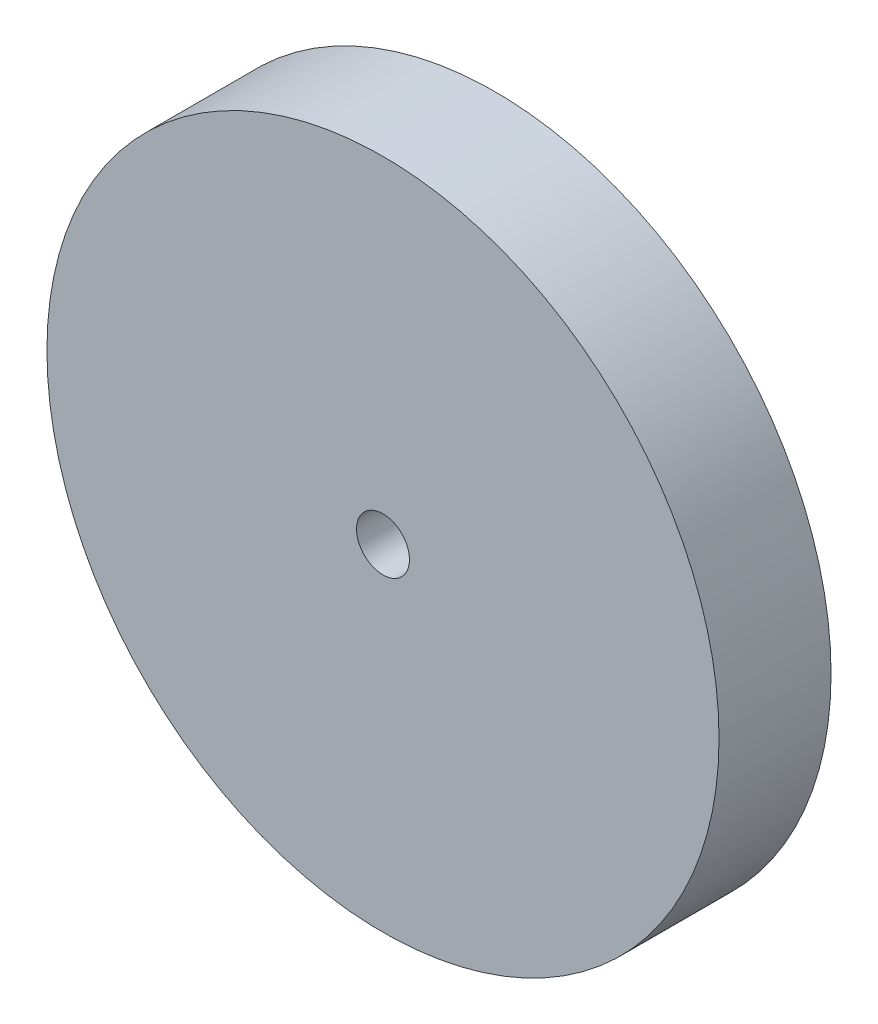
ISO-10303-21;
HEADER;
FILE_DESCRIPTION(('STEP AP214'),'2;1');
FILE_NAME('part.step','',(''),(''),'','','');
FILE_SCHEMA(('AUTOMOTIVE_DESIGN { 1 0 10303 214 1 1 1 1 }'));
ENDSEC;
DATA;
#1=APPLICATION_CONTEXT('core data for automotive mechanical design processes');
#2=APPLICATION_PROTOCOL_DEFINITION('international standard','automotive_design',2000,#1);
#3=PRODUCT_CONTEXT('',#1,'mechanical');
#4=PRODUCT('Part','Part','',(#3));
#5=PRODUCT_RELATED_PRODUCT_CATEGORY('part','',(#4));
#6=PRODUCT_DEFINITION_FORMATION('','',#4);
#7=PRODUCT_DEFINITION_CONTEXT('part definition',#1,'design');
#8=PRODUCT_DEFINITION('design','',#6,#7);
#9=PRODUCT_DEFINITION_SHAPE('','',#8);
#10=(LENGTH_UNIT() NAMED_UNIT(*) SI_UNIT(.MILLI.,.METRE.));
#11=(NAMED_UNIT(*) PLANE_ANGLE_UNIT() SI_UNIT($,.RADIAN.));
#12=(NAMED_UNIT(*) SI_UNIT($,.STERADIAN.) SOLID_ANGLE_UNIT());
#13=UNCERTAINTY_MEASURE_WITH_UNIT(LENGTH_MEASURE(1.E-05),#10,'distance_accuracy_value','');
#14=(GEOMETRIC_REPRESENTATION_CONTEXT(3) GLOBAL_UNCERTAINTY_ASSIGNED_CONTEXT((#13)) GLOBAL_UNIT_ASSIGNED_CONTEXT((#10,
#11,#12)) REPRESENTATION_CONTEXT('',''));
#15=CARTESIAN_POINT('',(0.,0.,0.));
#16=DIRECTION('',(0.,0.,1.));
#17=DIRECTION('',(1.,0.,0.));
#18=AXIS2_PLACEMENT_3D('',#15,#16,#17);
#19=CARTESIAN_POINT('',(0.,0.,12.7));
#20=DIRECTION('',(0.,0.,-1.));
#21=DIRECTION('',(-1.,0.,0.));
#22=AXIS2_PLACEMENT_3D('',#19,#20,#21);
#23=CYLINDRICAL_SURFACE('',#22,3.);
#24=CARTESIAN_POINT('',(0.,0.,12.7));
#25=DIRECTION('',(0.,0.,1.));
#26=DIRECTION('',(1.,0.,0.));
#27=AXIS2_PLACEMENT_3D('',#24,#25,#26);
#28=CIRCLE('',#27,3.);
#29=CARTESIAN_POINT('',(3.,0.,12.7));
#30=VERTEX_POINT('',#29);
#31=EDGE_CURVE('E46',#30,#30,#28,.T.);
#32=ORIENTED_EDGE('',*,*,#31,.T.);
#33=EDGE_LOOP('',(#32));
#34=FACE_BOUND('',#33,.T.);
#35=CARTESIAN_POINT('',(0.,0.,5.08));
#36=DIRECTION('',(0.,0.,-1.));
#37=DIRECTION('',(-1.,0.,0.));
#38=AXIS2_PLACEMENT_3D('',#35,#36,#37);
#39=CIRCLE('',#38,3.);
#40=CARTESIAN_POINT('',(-3.,0.,5.08));
#41=VERTEX_POINT('',#40);
#42=EDGE_CURVE('E37',#41,#41,#39,.T.);
#43=ORIENTED_EDGE('',*,*,#42,.T.);
#44=EDGE_LOOP('',(#43));
#45=FACE_BOUND('',#44,.T.);
#46=ADVANCED_FACE('F33',(#34,#45),#23,.F.);
#47=CARTESIAN_POINT('',(0.,0.,12.7));
#48=DIRECTION('',(0.,0.,1.));
#49=DIRECTION('',(1.,0.,0.));
#50=AXIS2_PLACEMENT_3D('',#47,#48,#49);
#51=PLANE('',#50);
#52=CARTESIAN_POINT('',(0.,0.,12.7));
#53=DIRECTION('',(0.,0.,1.));
#54=DIRECTION('',(1.,0.,0.));
#55=AXIS2_PLACEMENT_3D('',#52,#53,#54);
#56=CIRCLE('',#55,38.1);
#57=CARTESIAN_POINT('',(38.1,0.,12.7));
#58=VERTEX_POINT('',#57);
#59=EDGE_CURVE('E10',#58,#58,#56,.T.);
#60=ORIENTED_EDGE('',*,*,#59,.T.);
#61=EDGE_LOOP('',(#60));
#62=FACE_BOUND('',#61,.T.);
#63=ORIENTED_EDGE('',*,*,#31,.F.);
#64=EDGE_LOOP('',(#63));
#65=FACE_BOUND('',#64,.T.);
#66=ADVANCED_FACE('F71',(#62,#65),#51,.T.);
#67=CARTESIAN_POINT('',(0.,0.,0.));
#68=DIRECTION('',(0.,0.,1.));
#69=DIRECTION('',(1.,0.,0.));
#70=AXIS2_PLACEMENT_3D('',#67,#68,#69);
#71=PLANE('',#70);
#72=CARTESIAN_POINT('',(0.,0.,0.));
#73=DIRECTION('',(0.,0.,-1.));
#74=DIRECTION('',(-1.,0.,0.));
#75=AXIS2_PLACEMENT_3D('',#72,#73,#74);
#76=CIRCLE('',#75,7.9375);
#77=CARTESIAN_POINT('',(-7.9375,0.,0.));
#78=VERTEX_POINT('',#77);
#79=EDGE_CURVE('E50',#78,#78,#76,.T.);
#80=ORIENTED_EDGE('',*,*,#79,.F.);
#81=EDGE_LOOP('',(#80));
#82=FACE_BOUND('',#81,.T.);
#83=CARTESIAN_POINT('',(0.,0.,0.));
#84=DIRECTION('',(0.,0.,1.));
#85=DIRECTION('',(1.,0.,0.));
#86=AXIS2_PLACEMENT_3D('',#83,#84,#85);
#87=CIRCLE('',#86,38.1);
#88=CARTESIAN_POINT('',(38.1,0.,0.));
#89=VERTEX_POINT('',#88);
#90=EDGE_CURVE('E41',#89,#89,#87,.T.);
#91=ORIENTED_EDGE('',*,*,#90,.F.);
#92=EDGE_LOOP('',(#91));
#93=FACE_BOUND('',#92,.T.);
#94=ADVANCED_FACE('F79',(#82,#93),#71,.F.);
#95=CARTESIAN_POINT('',(0.,0.,12.7));
#96=DIRECTION('',(0.,0.,-1.));
#97=DIRECTION('',(-1.,0.,0.));
#98=AXIS2_PLACEMENT_3D('',#95,#96,#97);
#99=CYLINDRICAL_SURFACE('',#98,38.1);
#100=ORIENTED_EDGE('',*,*,#59,.F.);
#101=EDGE_LOOP('',(#100));
#102=FACE_BOUND('',#101,.T.);
#103=ORIENTED_EDGE('',*,*,#90,.T.);
#104=EDGE_LOOP('',(#103));
#105=FACE_BOUND('',#104,.T.);
#106=ADVANCED_FACE('F35',(#102,#105),#99,.T.);
#107=CARTESIAN_POINT('',(0.,0.,5.08));
#108=DIRECTION('',(0.,0.,-1.));
#109=DIRECTION('',(-1.,0.,0.));
#110=AXIS2_PLACEMENT_3D('',#107,#108,#109);
#111=CYLINDRICAL_SURFACE('',#110,7.9375);
#112=CARTESIAN_POINT('',(0.,0.,5.08));
#113=DIRECTION('',(0.,0.,-1.));
#114=DIRECTION('',(-1.,0.,0.));
#115=AXIS2_PLACEMENT_3D('',#112,#113,#114);
#116=CIRCLE('',#115,7.9375);
#117=CARTESIAN_POINT('',(-7.9375,0.,5.08));
#118=VERTEX_POINT('',#117);
#119=EDGE_CURVE('E53',#118,#118,#116,.T.);
#120=ORIENTED_EDGE('',*,*,#119,.F.);
#121=EDGE_LOOP('',(#120));
#122=FACE_BOUND('',#121,.T.);
#123=ORIENTED_EDGE('',*,*,#79,.T.);
#124=EDGE_LOOP('',(#123));
#125=FACE_BOUND('',#124,.T.);
#126=ADVANCED_FACE('F63',(#122,#125),#111,.F.);
#127=CARTESIAN_POINT('',(0.,0.,5.08));
#128=DIRECTION('',(0.,0.,-1.));
#129=DIRECTION('',(-1.,0.,0.));
#130=AXIS2_PLACEMENT_3D('',#127,#128,#129);
#131=PLANE('',#130);
#132=ORIENTED_EDGE('',*,*,#42,.F.);
#133=EDGE_LOOP('',(#132));
#134=FACE_BOUND('',#133,.T.);
#135=ORIENTED_EDGE('',*,*,#119,.T.);
#136=EDGE_LOOP('',(#135));
#137=FACE_BOUND('',#136,.T.);
#138=ADVANCED_FACE('F61',(#134,#137),#131,.T.);
#139=CLOSED_SHELL('',(#46,#66,#94,#106,#126,#138));
#140=MANIFOLD_SOLID_BREP('B2',#139);
#141=ADVANCED_BREP_SHAPE_REPRESENTATION('',(#18,#140),#14);
#142=SHAPE_DEFINITION_REPRESENTATION(#9,#141);
ENDSEC;
END-ISO-10303-21;
